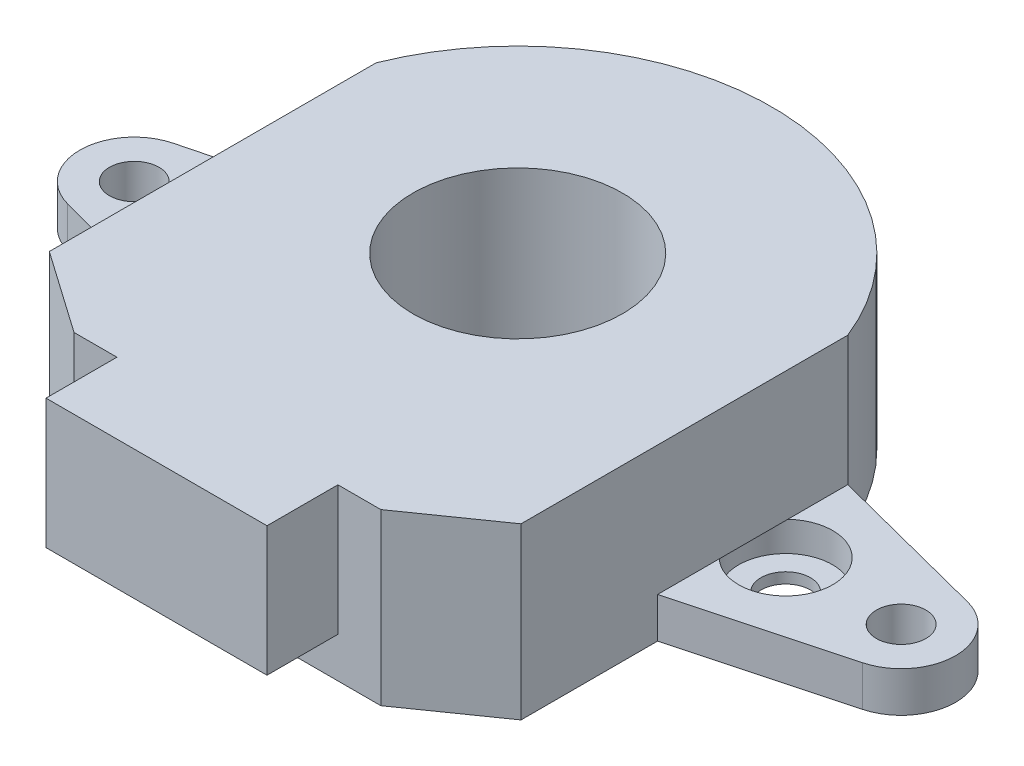
ISO-10303-21;
HEADER;
FILE_DESCRIPTION(('STEP AP214'),'2;1');
FILE_NAME('part.step','',(''),(''),'','','');
FILE_SCHEMA(('AUTOMOTIVE_DESIGN { 1 0 10303 214 1 1 1 1 }'));
ENDSEC;
DATA;
#1=APPLICATION_CONTEXT('core data for automotive mechanical design processes');
#2=APPLICATION_PROTOCOL_DEFINITION('international standard','automotive_design',2000,#1);
#3=PRODUCT_CONTEXT('',#1,'mechanical');
#4=PRODUCT('Part','Part','',(#3));
#5=PRODUCT_RELATED_PRODUCT_CATEGORY('part','',(#4));
#6=PRODUCT_DEFINITION_FORMATION('','',#4);
#7=PRODUCT_DEFINITION_CONTEXT('part definition',#1,'design');
#8=PRODUCT_DEFINITION('design','',#6,#7);
#9=PRODUCT_DEFINITION_SHAPE('','',#8);
#10=(LENGTH_UNIT() NAMED_UNIT(*) SI_UNIT(.MILLI.,.METRE.));
#11=(NAMED_UNIT(*) PLANE_ANGLE_UNIT() SI_UNIT($,.RADIAN.));
#12=(NAMED_UNIT(*) SI_UNIT($,.STERADIAN.) SOLID_ANGLE_UNIT());
#13=UNCERTAINTY_MEASURE_WITH_UNIT(LENGTH_MEASURE(1.E-05),#10,'distance_accuracy_value','');
#14=(GEOMETRIC_REPRESENTATION_CONTEXT(3) GLOBAL_UNCERTAINTY_ASSIGNED_CONTEXT((#13)) GLOBAL_UNIT_ASSIGNED_CONTEXT((#10,
#11,#12)) REPRESENTATION_CONTEXT('',''));
#15=CARTESIAN_POINT('',(0.,0.,0.));
#16=DIRECTION('',(0.,0.,1.));
#17=DIRECTION('',(1.,0.,0.));
#18=AXIS2_PLACEMENT_3D('',#15,#16,#17);
#19=CARTESIAN_POINT('',(0.,2.45,0.));
#20=DIRECTION('',(0.,1.,0.));
#21=DIRECTION('',(0.,0.,1.));
#22=AXIS2_PLACEMENT_3D('',#19,#20,#21);
#23=PLANE('',#22);
#24=DIRECTION('',(0.,0.,-1.));
#25=VECTOR('',#24,1.);
#26=CARTESIAN_POINT('',(14.3,2.45,-5.7157676649773));
#27=LINE('',#26,#25);
#28=CARTESIAN_POINT('',(14.3,2.45,5.81455666761185));
#29=VERTEX_POINT('',#28);
#30=CARTESIAN_POINT('',(14.3,2.45,2.07846096908265));
#31=VERTEX_POINT('',#30);
#32=EDGE_CURVE('E11',#29,#31,#27,.T.);
#33=ORIENTED_EDGE('',*,*,#32,.F.);
#34=DIRECTION('',(-0.965925826289068,0.,0.258819045102523));
#35=VECTOR('',#34,1.);
#36=CARTESIAN_POINT('',(2.41155752984425,2.45,9.00005522675396));
#37=LINE('',#36,#35);
#38=CARTESIAN_POINT('',(24.1041028488383,2.45,3.18755522675393));
#39=VERTEX_POINT('',#38);
#40=EDGE_CURVE('E329',#39,#29,#37,.T.);
#41=ORIENTED_EDGE('',*,*,#40,.F.);
#42=CARTESIAN_POINT('',(23.25,2.45,0.));
#43=DIRECTION('',(0.,1.,0.));
#44=DIRECTION('',(0.,0.,1.));
#45=AXIS2_PLACEMENT_3D('',#42,#43,#44);
#46=CIRCLE('',#45,3.3);
#47=CARTESIAN_POINT('',(24.0739769814121,2.45,-3.19547522820989));
#48=VERTEX_POINT('',#47);
#49=EDGE_CURVE('E323',#48,#39,#46,.F.);
#50=ORIENTED_EDGE('',*,*,#49,.F.);
#51=DIRECTION('',(-0.96832582673027,0.,-0.249689994367294));
#52=VECTOR('',#51,1.);
#53=CARTESIAN_POINT('',(2.27350040033806,2.45,-8.81688976087108));
#54=LINE('',#53,#52);
#55=CARTESIAN_POINT('',(14.3,2.45,-5.7157676649773));
#56=VERTEX_POINT('',#55);
#57=EDGE_CURVE('E326',#48,#56,#54,.T.);
#58=ORIENTED_EDGE('',*,*,#57,.T.);
#59=CARTESIAN_POINT('',(14.3,2.45,-2.07846096908265));
#60=VERTEX_POINT('',#59);
#61=EDGE_CURVE('E44',#60,#56,#27,.T.);
#62=ORIENTED_EDGE('',*,*,#61,.F.);
#63=CARTESIAN_POINT('',(16.25,2.45,0.));
#64=DIRECTION('',(0.,1.,0.));
#65=DIRECTION('',(0.,0.,1.));
#66=AXIS2_PLACEMENT_3D('',#63,#64,#65);
#67=CIRCLE('',#66,2.85);
#68=EDGE_CURVE('E316',#31,#60,#67,.T.);
#69=ORIENTED_EDGE('',*,*,#68,.F.);
#70=EDGE_LOOP('',(#33,#41,#50,#58,#62,#69));
#71=FACE_BOUND('',#70,.T.);
#72=CARTESIAN_POINT('',(23.25,2.45,0.));
#73=DIRECTION('',(0.,1.,0.));
#74=DIRECTION('',(0.,0.,1.));
#75=AXIS2_PLACEMENT_3D('',#72,#73,#74);
#76=CIRCLE('',#75,1.5);
#77=CARTESIAN_POINT('',(23.25,2.45,1.5));
#78=VERTEX_POINT('',#77);
#79=EDGE_CURVE('E330',#78,#78,#76,.T.);
#80=ORIENTED_EDGE('',*,*,#79,.F.);
#81=EDGE_LOOP('',(#80));
#82=FACE_BOUND('',#81,.T.);
#83=ADVANCED_FACE('F35',(#71,#82),#23,.T.);
#84=CARTESIAN_POINT('',(-16.25,2.45,0.));
#85=DIRECTION('',(0.,-1.,0.));
#86=DIRECTION('',(0.,0.,-1.));
#87=AXIS2_PLACEMENT_3D('',#84,#85,#86);
#88=CYLINDRICAL_SURFACE('',#87,1.5);
#89=CARTESIAN_POINT('',(-16.25,0.,0.));
#90=DIRECTION('',(0.,-1.,0.));
#91=DIRECTION('',(0.,0.,1.));
#92=AXIS2_PLACEMENT_3D('',#89,#90,#91);
#93=CIRCLE('',#92,1.5);
#94=CARTESIAN_POINT('',(-16.25,0.,1.5));
#95=VERTEX_POINT('',#94);
#96=EDGE_CURVE('E450',#95,#95,#93,.T.);
#97=ORIENTED_EDGE('',*,*,#96,.T.);
#98=EDGE_LOOP('',(#97));
#99=FACE_BOUND('',#98,.T.);
#100=CARTESIAN_POINT('',(-16.25,0.65,0.));
#101=DIRECTION('',(0.,1.,0.));
#102=DIRECTION('',(0.,0.,1.));
#103=AXIS2_PLACEMENT_3D('',#100,#101,#102);
#104=CIRCLE('',#103,1.5);
#105=CARTESIAN_POINT('',(-16.25,0.65,1.5));
#106=VERTEX_POINT('',#105);
#107=EDGE_CURVE('E445',#106,#106,#104,.F.);
#108=ORIENTED_EDGE('',*,*,#107,.F.);
#109=EDGE_LOOP('',(#108));
#110=FACE_BOUND('',#109,.T.);
#111=ADVANCED_FACE('F411',(#99,#110),#88,.F.);
#112=CARTESIAN_POINT('',(16.25,2.45,0.));
#113=DIRECTION('',(0.,-1.,0.));
#114=DIRECTION('',(0.,0.,-1.));
#115=AXIS2_PLACEMENT_3D('',#112,#113,#114);
#116=CYLINDRICAL_SURFACE('',#115,1.5);
#117=CARTESIAN_POINT('',(16.25,0.,0.));
#118=DIRECTION('',(0.,1.,0.));
#119=DIRECTION('',(0.,0.,1.));
#120=AXIS2_PLACEMENT_3D('',#117,#118,#119);
#121=CIRCLE('',#120,1.5);
#122=CARTESIAN_POINT('',(16.25,0.,1.5));
#123=VERTEX_POINT('',#122);
#124=EDGE_CURVE('E327',#123,#123,#121,.T.);
#125=ORIENTED_EDGE('',*,*,#124,.F.);
#126=EDGE_LOOP('',(#125));
#127=FACE_BOUND('',#126,.T.);
#128=CARTESIAN_POINT('',(16.25,0.65,0.));
#129=DIRECTION('',(0.,1.,0.));
#130=DIRECTION('',(0.,0.,1.));
#131=AXIS2_PLACEMENT_3D('',#128,#129,#130);
#132=CIRCLE('',#131,1.5);
#133=CARTESIAN_POINT('',(16.25,0.65,1.5));
#134=VERTEX_POINT('',#133);
#135=EDGE_CURVE('E294',#134,#134,#132,.T.);
#136=ORIENTED_EDGE('',*,*,#135,.T.);
#137=EDGE_LOOP('',(#136));
#138=FACE_BOUND('',#137,.T.);
#139=ADVANCED_FACE('F419',(#127,#138),#116,.F.);
#140=CARTESIAN_POINT('',(14.3,2.45,-5.7157676649773));
#141=DIRECTION('',(-1.,0.,0.));
#142=DIRECTION('',(0.,0.,1.));
#143=AXIS2_PLACEMENT_3D('',#140,#141,#142);
#144=PLANE('',#143);
#145=DIRECTION('',(0.,-1.,0.));
#146=VECTOR('',#145,1.);
#147=CARTESIAN_POINT('',(14.3,2.45,5.81455666761185));
#148=LINE('',#147,#146);
#149=CARTESIAN_POINT('',(14.3,0.,5.81455666761185));
#150=VERTEX_POINT('',#149);
#151=EDGE_CURVE('E347',#29,#150,#148,.T.);
#152=ORIENTED_EDGE('',*,*,#151,.F.);
#153=ORIENTED_EDGE('',*,*,#32,.T.);
#154=EDGE_CURVE('E184',#31,#60,#27,.T.);
#155=ORIENTED_EDGE('',*,*,#154,.T.);
#156=ORIENTED_EDGE('',*,*,#61,.T.);
#157=DIRECTION('',(0.,-1.,0.));
#158=VECTOR('',#157,1.);
#159=CARTESIAN_POINT('',(14.3,10.3,-5.7157676649773));
#160=LINE('',#159,#158);
#161=CARTESIAN_POINT('',(14.3,10.3,-5.7157676649773));
#162=VERTEX_POINT('',#161);
#163=EDGE_CURVE('E238',#162,#56,#160,.T.);
#164=ORIENTED_EDGE('',*,*,#163,.F.);
#165=DIRECTION('',(0.,0.,-1.));
#166=VECTOR('',#165,1.);
#167=CARTESIAN_POINT('',(14.3,10.3,-5.7157676649773));
#168=LINE('',#167,#166);
#169=CARTESIAN_POINT('',(14.3,10.3,14.0989623089514));
#170=VERTEX_POINT('',#169);
#171=EDGE_CURVE('E179',#170,#162,#168,.T.);
#172=ORIENTED_EDGE('',*,*,#171,.F.);
#173=DIRECTION('',(0.,-1.,0.));
#174=VECTOR('',#173,1.);
#175=CARTESIAN_POINT('',(14.3,2.45,14.0989623089515));
#176=LINE('',#175,#174);
#177=CARTESIAN_POINT('',(14.3,0.,14.0989623089514));
#178=VERTEX_POINT('',#177);
#179=EDGE_CURVE('E255',#170,#178,#176,.T.);
#180=ORIENTED_EDGE('',*,*,#179,.T.);
#181=DIRECTION('',(0.,0.,-1.));
#182=VECTOR('',#181,1.);
#183=CARTESIAN_POINT('',(14.3,0.,-5.7157676649773));
#184=LINE('',#183,#182);
#185=EDGE_CURVE('E276',#178,#150,#184,.T.);
#186=ORIENTED_EDGE('',*,*,#185,.T.);
#187=EDGE_LOOP('',(#152,#153,#155,#156,#164,#172,#180,#186));
#188=FACE_BOUND('',#187,.T.);
#189=ADVANCED_FACE('F370',(#188),#144,.F.);
#190=DIRECTION('',(0.,0.,-1.));
#191=VECTOR('',#190,1.);
#192=CARTESIAN_POINT('',(-14.3,2.45,-5.7157676649773));
#193=LINE('',#192,#191);
#194=CARTESIAN_POINT('',(-14.3,2.45,-2.07846096908265));
#195=VERTEX_POINT('',#194);
#196=CARTESIAN_POINT('',(-14.3,2.45,-5.7157676649773));
#197=VERTEX_POINT('',#196);
#198=EDGE_CURVE('E224',#195,#197,#193,.T.);
#199=ORIENTED_EDGE('',*,*,#198,.T.);
#200=DIRECTION('',(0.96832582673027,0.,-0.249689994367294));
#201=VECTOR('',#200,1.);
#202=CARTESIAN_POINT('',(-2.27350040033806,2.45,-8.81688976087108));
#203=LINE('',#202,#201);
#204=CARTESIAN_POINT('',(-24.0739769814121,2.45,-3.19547522820989));
#205=VERTEX_POINT('',#204);
#206=EDGE_CURVE('E438',#205,#197,#203,.T.);
#207=ORIENTED_EDGE('',*,*,#206,.F.);
#208=CARTESIAN_POINT('',(-23.25,2.45,0.));
#209=DIRECTION('',(0.,-1.,0.));
#210=DIRECTION('',(0.,0.,1.));
#211=AXIS2_PLACEMENT_3D('',#208,#209,#210);
#212=CIRCLE('',#211,3.3);
#213=CARTESIAN_POINT('',(-24.1041028488383,2.45,3.18755522675393));
#214=VERTEX_POINT('',#213);
#215=EDGE_CURVE('E452',#205,#214,#212,.F.);
#216=ORIENTED_EDGE('',*,*,#215,.T.);
#217=DIRECTION('',(0.965925826289068,0.,0.258819045102523));
#218=VECTOR('',#217,1.);
#219=CARTESIAN_POINT('',(-2.41155752984425,2.45,9.00005522675396));
#220=LINE('',#219,#218);
#221=CARTESIAN_POINT('',(-14.3,2.45,5.81455666761185));
#222=VERTEX_POINT('',#221);
#223=EDGE_CURVE('E308',#214,#222,#220,.T.);
#224=ORIENTED_EDGE('',*,*,#223,.T.);
#225=CARTESIAN_POINT('',(-14.3,2.45,2.07846096908265));
#226=VERTEX_POINT('',#225);
#227=EDGE_CURVE('E60',#222,#226,#193,.T.);
#228=ORIENTED_EDGE('',*,*,#227,.T.);
#229=CARTESIAN_POINT('',(-16.25,2.45,0.));
#230=DIRECTION('',(0.,-1.,0.));
#231=DIRECTION('',(0.,0.,1.));
#232=AXIS2_PLACEMENT_3D('',#229,#230,#231);
#233=CIRCLE('',#232,2.85);
#234=EDGE_CURVE('E246',#226,#195,#233,.T.);
#235=ORIENTED_EDGE('',*,*,#234,.T.);
#236=EDGE_LOOP('',(#199,#207,#216,#224,#228,#235));
#237=FACE_BOUND('',#236,.T.);
#238=CARTESIAN_POINT('',(-23.25,2.45,0.));
#239=DIRECTION('',(0.,-1.,0.));
#240=DIRECTION('',(0.,0.,1.));
#241=AXIS2_PLACEMENT_3D('',#238,#239,#240);
#242=CIRCLE('',#241,1.5);
#243=CARTESIAN_POINT('',(-23.25,2.45,1.5));
#244=VERTEX_POINT('',#243);
#245=EDGE_CURVE('E436',#244,#244,#242,.T.);
#246=ORIENTED_EDGE('',*,*,#245,.T.);
#247=EDGE_LOOP('',(#246));
#248=FACE_BOUND('',#247,.T.);
#249=ADVANCED_FACE('F413',(#237,#248),#23,.T.);
#250=CARTESIAN_POINT('',(0.,0.,0.));
#251=DIRECTION('',(0.,1.,0.));
#252=DIRECTION('',(0.,0.,1.));
#253=AXIS2_PLACEMENT_3D('',#250,#251,#252);
#254=PLANE('',#253);
#255=DIRECTION('',(1.,0.,0.));
#256=VECTOR('',#255,1.);
#257=CARTESIAN_POINT('',(-14.3,0.,17.6));
#258=LINE('',#257,#256);
#259=CARTESIAN_POINT('',(-9.29999999999996,0.,17.6));
#260=VERTEX_POINT('',#259);
#261=CARTESIAN_POINT('',(9.29999999999996,0.,17.6));
#262=VERTEX_POINT('',#261);
#263=EDGE_CURVE('E288',#260,#262,#258,.T.);
#264=ORIENTED_EDGE('',*,*,#263,.F.);
#265=DIRECTION('',(0.819152044288993,0.,0.573576436351044));
#266=VECTOR('',#265,1.);
#267=CARTESIAN_POINT('',(-9.29999999999996,0.,17.6));
#268=LINE('',#267,#266);
#269=CARTESIAN_POINT('',(-14.3,0.,14.0989623089514));
#270=VERTEX_POINT('',#269);
#271=EDGE_CURVE('E383',#260,#270,#268,.F.);
#272=ORIENTED_EDGE('',*,*,#271,.T.);
#273=DIRECTION('',(0.,0.,1.));
#274=VECTOR('',#273,1.);
#275=CARTESIAN_POINT('',(-14.3,0.,-5.7157676649773));
#276=LINE('',#275,#274);
#277=CARTESIAN_POINT('',(-14.3,0.,5.81455666761185));
#278=VERTEX_POINT('',#277);
#279=EDGE_CURVE('E291',#278,#270,#276,.T.);
#280=ORIENTED_EDGE('',*,*,#279,.F.);
#281=DIRECTION('',(0.965925826289068,0.,0.258819045102523));
#282=VECTOR('',#281,1.);
#283=CARTESIAN_POINT('',(-2.41155752984425,0.,9.00005522675396));
#284=LINE('',#283,#282);
#285=CARTESIAN_POINT('',(-24.1041028488383,0.,3.18755522675393));
#286=VERTEX_POINT('',#285);
#287=EDGE_CURVE('E296',#286,#278,#284,.T.);
#288=ORIENTED_EDGE('',*,*,#287,.F.);
#289=CARTESIAN_POINT('',(-23.25,0.,0.));
#290=DIRECTION('',(0.,-1.,0.));
#291=DIRECTION('',(0.,0.,1.));
#292=AXIS2_PLACEMENT_3D('',#289,#290,#291);
#293=CIRCLE('',#292,3.3);
#294=CARTESIAN_POINT('',(-24.0739769814121,0.,-3.19547522820989));
#295=VERTEX_POINT('',#294);
#296=EDGE_CURVE('E299',#295,#286,#293,.F.);
#297=ORIENTED_EDGE('',*,*,#296,.F.);
#298=DIRECTION('',(0.96832582673027,0.,-0.249689994367294));
#299=VECTOR('',#298,1.);
#300=CARTESIAN_POINT('',(-2.27350040033806,0.,-8.81688976087108));
#301=LINE('',#300,#299);
#302=CARTESIAN_POINT('',(-14.3,0.,-5.7157676649773));
#303=VERTEX_POINT('',#302);
#304=EDGE_CURVE('E298',#295,#303,#301,.T.);
#305=ORIENTED_EDGE('',*,*,#304,.T.);
#306=CARTESIAN_POINT('',(0.,0.,0.));
#307=DIRECTION('',(0.,1.,0.));
#308=DIRECTION('',(0.,0.,1.));
#309=AXIS2_PLACEMENT_3D('',#306,#307,#308);
#310=CIRCLE('',#309,15.4);
#311=CARTESIAN_POINT('',(14.3,0.,-5.7157676649773));
#312=VERTEX_POINT('',#311);
#313=EDGE_CURVE('E273',#312,#303,#310,.T.);
#314=ORIENTED_EDGE('',*,*,#313,.F.);
#315=DIRECTION('',(-0.96832582673027,0.,-0.249689994367294));
#316=VECTOR('',#315,1.);
#317=CARTESIAN_POINT('',(2.27350040033806,0.,-8.81688976087108));
#318=LINE('',#317,#316);
#319=CARTESIAN_POINT('',(24.0739769814121,0.,-3.19547522820989));
#320=VERTEX_POINT('',#319);
#321=EDGE_CURVE('E337',#320,#312,#318,.T.);
#322=ORIENTED_EDGE('',*,*,#321,.F.);
#323=CARTESIAN_POINT('',(23.25,0.,0.));
#324=DIRECTION('',(0.,1.,0.));
#325=DIRECTION('',(0.,0.,1.));
#326=AXIS2_PLACEMENT_3D('',#323,#324,#325);
#327=CIRCLE('',#326,3.3);
#328=CARTESIAN_POINT('',(24.1041028488383,0.,3.18755522675393));
#329=VERTEX_POINT('',#328);
#330=EDGE_CURVE('E334',#320,#329,#327,.F.);
#331=ORIENTED_EDGE('',*,*,#330,.T.);
#332=DIRECTION('',(-0.965925826289068,0.,0.258819045102523));
#333=VECTOR('',#332,1.);
#334=CARTESIAN_POINT('',(2.41155752984425,0.,9.00005522675396));
#335=LINE('',#334,#333);
#336=EDGE_CURVE('E340',#329,#150,#335,.T.);
#337=ORIENTED_EDGE('',*,*,#336,.T.);
#338=ORIENTED_EDGE('',*,*,#185,.F.);
#339=DIRECTION('',(0.819152044288993,0.,-0.573576436351044));
#340=VECTOR('',#339,1.);
#341=CARTESIAN_POINT('',(14.3,0.,14.0989623089515));
#342=LINE('',#341,#340);
#343=EDGE_CURVE('E380',#178,#262,#342,.F.);
#344=ORIENTED_EDGE('',*,*,#343,.T.);
#345=EDGE_LOOP('',(#264,#272,#280,#288,#297,#305,#314,#322,#331,#337,#338,#344));
#346=FACE_BOUND('',#345,.T.);
#347=CARTESIAN_POINT('',(0.,0.,0.));
#348=DIRECTION('',(0.,1.,0.));
#349=DIRECTION('',(0.,0.,1.));
#350=AXIS2_PLACEMENT_3D('',#347,#348,#349);
#351=CIRCLE('',#350,6.35);
#352=CARTESIAN_POINT('',(0.,0.,6.35));
#353=VERTEX_POINT('',#352);
#354=EDGE_CURVE('E284',#353,#353,#351,.T.);
#355=ORIENTED_EDGE('',*,*,#354,.T.);
#356=EDGE_LOOP('',(#355));
#357=FACE_BOUND('',#356,.T.);
#358=CARTESIAN_POINT('',(23.25,0.,0.));
#359=DIRECTION('',(0.,1.,0.));
#360=DIRECTION('',(0.,0.,1.));
#361=AXIS2_PLACEMENT_3D('',#358,#359,#360);
#362=CIRCLE('',#361,1.5);
#363=CARTESIAN_POINT('',(23.25,0.,1.5));
#364=VERTEX_POINT('',#363);
#365=EDGE_CURVE('E341',#364,#364,#362,.T.);
#366=ORIENTED_EDGE('',*,*,#365,.T.);
#367=EDGE_LOOP('',(#366));
#368=FACE_BOUND('',#367,.T.);
#369=ORIENTED_EDGE('',*,*,#124,.T.);
#370=EDGE_LOOP('',(#369));
#371=FACE_BOUND('',#370,.T.);
#372=CARTESIAN_POINT('',(-23.25,0.,0.));
#373=DIRECTION('',(0.,-1.,0.));
#374=DIRECTION('',(0.,0.,1.));
#375=AXIS2_PLACEMENT_3D('',#372,#373,#374);
#376=CIRCLE('',#375,1.5);
#377=CARTESIAN_POINT('',(-23.25,0.,1.5));
#378=VERTEX_POINT('',#377);
#379=EDGE_CURVE('E448',#378,#378,#376,.T.);
#380=ORIENTED_EDGE('',*,*,#379,.F.);
#381=EDGE_LOOP('',(#380));
#382=FACE_BOUND('',#381,.T.);
#383=ORIENTED_EDGE('',*,*,#96,.F.);
#384=EDGE_LOOP('',(#383));
#385=FACE_BOUND('',#384,.T.);
#386=ADVANCED_FACE('F386',(#346,#357,#368,#371,#382,#385),#254,.F.);
#387=CARTESIAN_POINT('',(-14.3,2.45,-5.7157676649773));
#388=DIRECTION('',(1.,0.,0.));
#389=DIRECTION('',(0.,0.,-1.));
#390=AXIS2_PLACEMENT_3D('',#387,#388,#389);
#391=PLANE('',#390);
#392=ORIENTED_EDGE('',*,*,#279,.T.);
#393=DIRECTION('',(0.,1.,0.));
#394=VECTOR('',#393,1.);
#395=CARTESIAN_POINT('',(-14.3,2.45,14.0989623089514));
#396=LINE('',#395,#394);
#397=CARTESIAN_POINT('',(-14.3,10.3,14.0989623089514));
#398=VERTEX_POINT('',#397);
#399=EDGE_CURVE('E200',#270,#398,#396,.T.);
#400=ORIENTED_EDGE('',*,*,#399,.T.);
#401=DIRECTION('',(0.,0.,-1.));
#402=VECTOR('',#401,1.);
#403=CARTESIAN_POINT('',(-14.3,10.3,-5.7157676649773));
#404=LINE('',#403,#402);
#405=CARTESIAN_POINT('',(-14.3,10.3,-5.7157676649773));
#406=VERTEX_POINT('',#405);
#407=EDGE_CURVE('E175',#398,#406,#404,.T.);
#408=ORIENTED_EDGE('',*,*,#407,.T.);
#409=DIRECTION('',(0.,-1.,0.));
#410=VECTOR('',#409,1.);
#411=CARTESIAN_POINT('',(-14.3,10.3,-5.7157676649773));
#412=LINE('',#411,#410);
#413=EDGE_CURVE('E188',#406,#197,#412,.T.);
#414=ORIENTED_EDGE('',*,*,#413,.T.);
#415=ORIENTED_EDGE('',*,*,#198,.F.);
#416=EDGE_CURVE('E222',#226,#195,#193,.T.);
#417=ORIENTED_EDGE('',*,*,#416,.F.);
#418=ORIENTED_EDGE('',*,*,#227,.F.);
#419=DIRECTION('',(0.,-1.,0.));
#420=VECTOR('',#419,1.);
#421=CARTESIAN_POINT('',(-14.3,2.45,5.81455666761185));
#422=LINE('',#421,#420);
#423=EDGE_CURVE('E302',#222,#278,#422,.T.);
#424=ORIENTED_EDGE('',*,*,#423,.T.);
#425=EDGE_LOOP('',(#392,#400,#408,#414,#415,#417,#418,#424));
#426=FACE_BOUND('',#425,.T.);
#427=ADVANCED_FACE('F198',(#426),#391,.F.);
#428=CARTESIAN_POINT('',(-14.3,2.45,17.6));
#429=DIRECTION('',(0.,0.,-1.));
#430=DIRECTION('',(-1.,0.,0.));
#431=AXIS2_PLACEMENT_3D('',#428,#429,#430);
#432=PLANE('',#431);
#433=DIRECTION('',(1.,0.,0.));
#434=VECTOR('',#433,1.);
#435=CARTESIAN_POINT('',(-14.3,2.45,17.6));
#436=LINE('',#435,#434);
#437=CARTESIAN_POINT('',(-6.7,2.45,17.6));
#438=VERTEX_POINT('',#437);
#439=CARTESIAN_POINT('',(6.69999999999999,2.45,17.6));
#440=VERTEX_POINT('',#439);
#441=EDGE_CURVE('E52',#438,#440,#436,.T.);
#442=ORIENTED_EDGE('',*,*,#441,.F.);
#443=DIRECTION('',(0.,-1.,0.));
#444=VECTOR('',#443,1.);
#445=CARTESIAN_POINT('',(-6.7,10.3,17.6));
#446=LINE('',#445,#444);
#447=CARTESIAN_POINT('',(-6.7,10.3,17.6));
#448=VERTEX_POINT('',#447);
#449=EDGE_CURVE('E195',#448,#438,#446,.T.);
#450=ORIENTED_EDGE('',*,*,#449,.F.);
#451=DIRECTION('',(-1.,0.,0.));
#452=VECTOR('',#451,1.);
#453=CARTESIAN_POINT('',(-9.29999999999996,10.3,17.6));
#454=LINE('',#453,#452);
#455=CARTESIAN_POINT('',(-9.29999999999996,10.3,17.6));
#456=VERTEX_POINT('',#455);
#457=EDGE_CURVE('E204',#448,#456,#454,.T.);
#458=ORIENTED_EDGE('',*,*,#457,.T.);
#459=DIRECTION('',(0.,-1.,0.));
#460=VECTOR('',#459,1.);
#461=CARTESIAN_POINT('',(-9.29999999999996,2.45,17.6));
#462=LINE('',#461,#460);
#463=EDGE_CURVE('E378',#456,#260,#462,.T.);
#464=ORIENTED_EDGE('',*,*,#463,.T.);
#465=ORIENTED_EDGE('',*,*,#263,.T.);
#466=DIRECTION('',(0.,1.,0.));
#467=VECTOR('',#466,1.);
#468=CARTESIAN_POINT('',(9.29999999999997,2.45,17.6));
#469=LINE('',#468,#467);
#470=CARTESIAN_POINT('',(9.29999999999996,10.3,17.6));
#471=VERTEX_POINT('',#470);
#472=EDGE_CURVE('E534',#262,#471,#469,.T.);
#473=ORIENTED_EDGE('',*,*,#472,.T.);
#474=DIRECTION('',(1.,0.,0.));
#475=VECTOR('',#474,1.);
#476=CARTESIAN_POINT('',(9.29999999999996,10.3,17.6));
#477=LINE('',#476,#475);
#478=CARTESIAN_POINT('',(6.7,10.3,17.6));
#479=VERTEX_POINT('',#478);
#480=EDGE_CURVE('E232',#479,#471,#477,.T.);
#481=ORIENTED_EDGE('',*,*,#480,.F.);
#482=DIRECTION('',(0.,-1.,0.));
#483=VECTOR('',#482,1.);
#484=CARTESIAN_POINT('',(6.7,10.3,17.6));
#485=LINE('',#484,#483);
#486=EDGE_CURVE('E242',#479,#440,#485,.T.);
#487=ORIENTED_EDGE('',*,*,#486,.T.);
#488=EDGE_LOOP('',(#442,#450,#458,#464,#465,#473,#481,#487));
#489=FACE_BOUND('',#488,.T.);
#490=ADVANCED_FACE('F263',(#489),#432,.F.);
#491=CARTESIAN_POINT('',(0.,2.45,0.));
#492=DIRECTION('',(0.,-1.,0.));
#493=DIRECTION('',(0.,0.,-1.));
#494=AXIS2_PLACEMENT_3D('',#491,#492,#493);
#495=CYLINDRICAL_SURFACE('',#494,15.4);
#496=DIRECTION('',(0.,-1.,0.));
#497=VECTOR('',#496,1.);
#498=CARTESIAN_POINT('',(-14.3,2.45,-5.7157676649773));
#499=LINE('',#498,#497);
#500=EDGE_CURVE('E191',#197,#303,#499,.T.);
#501=ORIENTED_EDGE('',*,*,#500,.F.);
#502=ORIENTED_EDGE('',*,*,#413,.F.);
#503=CARTESIAN_POINT('',(0.,10.3,0.));
#504=DIRECTION('',(0.,1.,0.));
#505=DIRECTION('',(0.,0.,-1.));
#506=AXIS2_PLACEMENT_3D('',#503,#504,#505);
#507=CIRCLE('',#506,15.4);
#508=EDGE_CURVE('E168',#162,#406,#507,.T.);
#509=ORIENTED_EDGE('',*,*,#508,.F.);
#510=ORIENTED_EDGE('',*,*,#163,.T.);
#511=DIRECTION('',(0.,-1.,0.));
#512=VECTOR('',#511,1.);
#513=CARTESIAN_POINT('',(14.3,2.45,-5.7157676649773));
#514=LINE('',#513,#512);
#515=EDGE_CURVE('E274',#56,#312,#514,.T.);
#516=ORIENTED_EDGE('',*,*,#515,.T.);
#517=ORIENTED_EDGE('',*,*,#313,.T.);
#518=EDGE_LOOP('',(#501,#502,#509,#510,#516,#517));
#519=FACE_BOUND('',#518,.T.);
#520=ADVANCED_FACE('F189',(#519),#495,.T.);
#521=CARTESIAN_POINT('',(0.,2.45,0.));
#522=DIRECTION('',(0.,-1.,0.));
#523=DIRECTION('',(0.,0.,-1.));
#524=AXIS2_PLACEMENT_3D('',#521,#522,#523);
#525=CYLINDRICAL_SURFACE('',#524,6.35);
#526=CARTESIAN_POINT('',(0.,10.3,0.));
#527=DIRECTION('',(0.,-1.,0.));
#528=DIRECTION('',(0.,0.,1.));
#529=AXIS2_PLACEMENT_3D('',#526,#527,#528);
#530=CIRCLE('',#529,6.35);
#531=CARTESIAN_POINT('',(0.,10.3,6.35));
#532=VERTEX_POINT('',#531);
#533=EDGE_CURVE('E183',#532,#532,#530,.T.);
#534=ORIENTED_EDGE('',*,*,#533,.F.);
#535=EDGE_LOOP('',(#534));
#536=FACE_BOUND('',#535,.T.);
#537=ORIENTED_EDGE('',*,*,#354,.F.);
#538=EDGE_LOOP('',(#537));
#539=FACE_BOUND('',#538,.T.);
#540=ADVANCED_FACE('F515',(#536,#539),#525,.F.);
#541=CARTESIAN_POINT('',(23.25,2.45,0.));
#542=DIRECTION('',(0.,-1.,0.));
#543=DIRECTION('',(0.,0.,-1.));
#544=AXIS2_PLACEMENT_3D('',#541,#542,#543);
#545=CYLINDRICAL_SURFACE('',#544,3.3);
#546=ORIENTED_EDGE('',*,*,#330,.F.);
#547=DIRECTION('',(0.,-1.,0.));
#548=VECTOR('',#547,1.);
#549=CARTESIAN_POINT('',(24.0739769814121,2.45,-3.19547522820989));
#550=LINE('',#549,#548);
#551=EDGE_CURVE('E349',#48,#320,#550,.T.);
#552=ORIENTED_EDGE('',*,*,#551,.F.);
#553=ORIENTED_EDGE('',*,*,#49,.T.);
#554=DIRECTION('',(0.,-1.,0.));
#555=VECTOR('',#554,1.);
#556=CARTESIAN_POINT('',(24.1041028488383,2.45,3.18755522675393));
#557=LINE('',#556,#555);
#558=EDGE_CURVE('E333',#39,#329,#557,.T.);
#559=ORIENTED_EDGE('',*,*,#558,.T.);
#560=EDGE_LOOP('',(#546,#552,#553,#559));
#561=FACE_BOUND('',#560,.T.);
#562=ADVANCED_FACE('F512',(#561),#545,.T.);
#563=CARTESIAN_POINT('',(2.27350040033806,2.45,-8.81688976087108));
#564=DIRECTION('',(-0.249689994367294,0.,0.96832582673027));
#565=DIRECTION('',(0.96832582673027,0.,0.249689994367294));
#566=AXIS2_PLACEMENT_3D('',#563,#564,#565);
#567=PLANE('',#566);
#568=ORIENTED_EDGE('',*,*,#321,.T.);
#569=ORIENTED_EDGE('',*,*,#515,.F.);
#570=ORIENTED_EDGE('',*,*,#57,.F.);
#571=ORIENTED_EDGE('',*,*,#551,.T.);
#572=EDGE_LOOP('',(#568,#569,#570,#571));
#573=FACE_BOUND('',#572,.T.);
#574=ADVANCED_FACE('F506',(#573),#567,.F.);
#575=CARTESIAN_POINT('',(23.25,2.45,0.));
#576=DIRECTION('',(0.,-1.,0.));
#577=DIRECTION('',(0.,0.,-1.));
#578=AXIS2_PLACEMENT_3D('',#575,#576,#577);
#579=CYLINDRICAL_SURFACE('',#578,1.5);
#580=ORIENTED_EDGE('',*,*,#79,.T.);
#581=EDGE_LOOP('',(#580));
#582=FACE_BOUND('',#581,.T.);
#583=ORIENTED_EDGE('',*,*,#365,.F.);
#584=EDGE_LOOP('',(#583));
#585=FACE_BOUND('',#584,.T.);
#586=ADVANCED_FACE('F503',(#582,#585),#579,.F.);
#587=CARTESIAN_POINT('',(2.41155752984425,2.45,9.00005522675396));
#588=DIRECTION('',(0.258819045102523,0.,0.965925826289068));
#589=DIRECTION('',(0.965925826289068,0.,-0.258819045102523));
#590=AXIS2_PLACEMENT_3D('',#587,#588,#589);
#591=PLANE('',#590);
#592=ORIENTED_EDGE('',*,*,#336,.F.);
#593=ORIENTED_EDGE('',*,*,#558,.F.);
#594=ORIENTED_EDGE('',*,*,#40,.T.);
#595=ORIENTED_EDGE('',*,*,#151,.T.);
#596=EDGE_LOOP('',(#592,#593,#594,#595));
#597=FACE_BOUND('',#596,.T.);
#598=ADVANCED_FACE('F363',(#597),#591,.T.);
#599=CARTESIAN_POINT('',(16.25,0.65,0.));
#600=DIRECTION('',(0.,1.,0.));
#601=DIRECTION('',(0.,0.,1.));
#602=AXIS2_PLACEMENT_3D('',#599,#600,#601);
#603=CYLINDRICAL_SURFACE('',#602,2.85);
#604=CARTESIAN_POINT('',(16.25,0.65,0.));
#605=DIRECTION('',(0.,1.,0.));
#606=DIRECTION('',(0.,0.,1.));
#607=AXIS2_PLACEMENT_3D('',#604,#605,#606);
#608=CIRCLE('',#607,2.85);
#609=CARTESIAN_POINT('',(16.25,0.65,2.85));
#610=VERTEX_POINT('',#609);
#611=EDGE_CURVE('E317',#610,#610,#608,.T.);
#612=ORIENTED_EDGE('',*,*,#611,.F.);
#613=EDGE_LOOP('',(#612));
#614=FACE_BOUND('',#613,.T.);
#615=EDGE_CURVE('E320',#60,#31,#67,.T.);
#616=ORIENTED_EDGE('',*,*,#615,.T.);
#617=ORIENTED_EDGE('',*,*,#68,.T.);
#618=EDGE_LOOP('',(#616,#617));
#619=FACE_BOUND('',#618,.T.);
#620=ADVANCED_FACE('F495',(#614,#619),#603,.F.);
#621=CARTESIAN_POINT('',(16.25,0.65,0.));
#622=DIRECTION('',(0.,1.,0.));
#623=DIRECTION('',(0.,0.,1.));
#624=AXIS2_PLACEMENT_3D('',#621,#622,#623);
#625=PLANE('',#624);
#626=ORIENTED_EDGE('',*,*,#135,.F.);
#627=EDGE_LOOP('',(#626));
#628=FACE_BOUND('',#627,.T.);
#629=ORIENTED_EDGE('',*,*,#611,.T.);
#630=EDGE_LOOP('',(#629));
#631=FACE_BOUND('',#630,.T.);
#632=ADVANCED_FACE('F491',(#628,#631),#625,.T.);
#633=CARTESIAN_POINT('',(-23.25,2.45,0.));
#634=DIRECTION('',(0.,-1.,0.));
#635=DIRECTION('',(0.,0.,-1.));
#636=AXIS2_PLACEMENT_3D('',#633,#634,#635);
#637=CYLINDRICAL_SURFACE('',#636,3.3);
#638=ORIENTED_EDGE('',*,*,#296,.T.);
#639=DIRECTION('',(0.,-1.,0.));
#640=VECTOR('',#639,1.);
#641=CARTESIAN_POINT('',(-24.1041028488383,2.45,3.18755522675393));
#642=LINE('',#641,#640);
#643=EDGE_CURVE('E306',#214,#286,#642,.T.);
#644=ORIENTED_EDGE('',*,*,#643,.F.);
#645=ORIENTED_EDGE('',*,*,#215,.F.);
#646=DIRECTION('',(0.,-1.,0.));
#647=VECTOR('',#646,1.);
#648=CARTESIAN_POINT('',(-24.0739769814121,2.45,-3.19547522820989));
#649=LINE('',#648,#647);
#650=EDGE_CURVE('E307',#205,#295,#649,.T.);
#651=ORIENTED_EDGE('',*,*,#650,.T.);
#652=EDGE_LOOP('',(#638,#644,#645,#651));
#653=FACE_BOUND('',#652,.T.);
#654=ADVANCED_FACE('F487',(#653),#637,.T.);
#655=CARTESIAN_POINT('',(-2.41155752984425,2.45,9.00005522675396));
#656=DIRECTION('',(0.258819045102523,0.,-0.965925826289068));
#657=DIRECTION('',(-0.965925826289068,0.,-0.258819045102523));
#658=AXIS2_PLACEMENT_3D('',#655,#656,#657);
#659=PLANE('',#658);
#660=ORIENTED_EDGE('',*,*,#287,.T.);
#661=ORIENTED_EDGE('',*,*,#423,.F.);
#662=ORIENTED_EDGE('',*,*,#223,.F.);
#663=ORIENTED_EDGE('',*,*,#643,.T.);
#664=EDGE_LOOP('',(#660,#661,#662,#663));
#665=FACE_BOUND('',#664,.T.);
#666=ADVANCED_FACE('F482',(#665),#659,.F.);
#667=CARTESIAN_POINT('',(-23.25,2.45,0.));
#668=DIRECTION('',(0.,-1.,0.));
#669=DIRECTION('',(0.,0.,-1.));
#670=AXIS2_PLACEMENT_3D('',#667,#668,#669);
#671=CYLINDRICAL_SURFACE('',#670,1.5);
#672=ORIENTED_EDGE('',*,*,#245,.F.);
#673=EDGE_LOOP('',(#672));
#674=FACE_BOUND('',#673,.T.);
#675=ORIENTED_EDGE('',*,*,#379,.T.);
#676=EDGE_LOOP('',(#675));
#677=FACE_BOUND('',#676,.T.);
#678=ADVANCED_FACE('F479',(#674,#677),#671,.F.);
#679=CARTESIAN_POINT('',(-2.27350040033806,2.45,-8.81688976087108));
#680=DIRECTION('',(-0.249689994367294,0.,-0.96832582673027));
#681=DIRECTION('',(-0.96832582673027,0.,0.249689994367294));
#682=AXIS2_PLACEMENT_3D('',#679,#680,#681);
#683=PLANE('',#682);
#684=ORIENTED_EDGE('',*,*,#304,.F.);
#685=ORIENTED_EDGE('',*,*,#650,.F.);
#686=ORIENTED_EDGE('',*,*,#206,.T.);
#687=ORIENTED_EDGE('',*,*,#500,.T.);
#688=EDGE_LOOP('',(#684,#685,#686,#687));
#689=FACE_BOUND('',#688,.T.);
#690=ADVANCED_FACE('F474',(#689),#683,.T.);
#691=CARTESIAN_POINT('',(-16.25,0.65,0.));
#692=DIRECTION('',(0.,1.,0.));
#693=DIRECTION('',(0.,0.,1.));
#694=AXIS2_PLACEMENT_3D('',#691,#692,#693);
#695=PLANE('',#694);
#696=CARTESIAN_POINT('',(-16.25,0.65,0.));
#697=DIRECTION('',(0.,-1.,0.));
#698=DIRECTION('',(0.,0.,1.));
#699=AXIS2_PLACEMENT_3D('',#696,#697,#698);
#700=CIRCLE('',#699,2.85);
#701=CARTESIAN_POINT('',(-16.25,0.65,2.85));
#702=VERTEX_POINT('',#701);
#703=EDGE_CURVE('E250',#702,#702,#700,.T.);
#704=ORIENTED_EDGE('',*,*,#703,.F.);
#705=EDGE_LOOP('',(#704));
#706=FACE_BOUND('',#705,.T.);
#707=ORIENTED_EDGE('',*,*,#107,.T.);
#708=EDGE_LOOP('',(#707));
#709=FACE_BOUND('',#708,.T.);
#710=ADVANCED_FACE('F465',(#706,#709),#695,.T.);
#711=CARTESIAN_POINT('',(-16.25,0.65,0.));
#712=DIRECTION('',(0.,1.,0.));
#713=DIRECTION('',(0.,0.,1.));
#714=AXIS2_PLACEMENT_3D('',#711,#712,#713);
#715=CYLINDRICAL_SURFACE('',#714,2.85);
#716=ORIENTED_EDGE('',*,*,#703,.T.);
#717=EDGE_LOOP('',(#716));
#718=FACE_BOUND('',#717,.T.);
#719=EDGE_CURVE('E457',#195,#226,#233,.T.);
#720=ORIENTED_EDGE('',*,*,#719,.F.);
#721=ORIENTED_EDGE('',*,*,#234,.F.);
#722=EDGE_LOOP('',(#720,#721));
#723=FACE_BOUND('',#722,.T.);
#724=ADVANCED_FACE('F463',(#718,#723),#715,.F.);
#725=CARTESIAN_POINT('',(-9.29999999999996,2.45,17.6));
#726=DIRECTION('',(0.573576436351044,0.,-0.819152044288993));
#727=DIRECTION('',(0.,-1.,0.));
#728=AXIS2_PLACEMENT_3D('',#725,#726,#727);
#729=PLANE('',#728);
#730=ORIENTED_EDGE('',*,*,#463,.F.);
#731=DIRECTION('',(-0.819152044288993,0.,-0.573576436351044));
#732=VECTOR('',#731,1.);
#733=CARTESIAN_POINT('',(-14.3,10.3,14.0989623089514));
#734=LINE('',#733,#732);
#735=EDGE_CURVE('E201',#456,#398,#734,.T.);
#736=ORIENTED_EDGE('',*,*,#735,.T.);
#737=ORIENTED_EDGE('',*,*,#399,.F.);
#738=ORIENTED_EDGE('',*,*,#271,.F.);
#739=EDGE_LOOP('',(#730,#736,#737,#738));
#740=FACE_BOUND('',#739,.T.);
#741=ADVANCED_FACE('F391',(#740),#729,.F.);
#742=CARTESIAN_POINT('',(14.3,2.45,14.0989623089515));
#743=DIRECTION('',(-0.573576436351044,0.,-0.819152044288993));
#744=DIRECTION('',(0.,-1.,0.));
#745=AXIS2_PLACEMENT_3D('',#742,#743,#744);
#746=PLANE('',#745);
#747=ORIENTED_EDGE('',*,*,#179,.F.);
#748=DIRECTION('',(0.819152044288993,0.,-0.573576436351044));
#749=VECTOR('',#748,1.);
#750=CARTESIAN_POINT('',(14.3,10.3,14.0989623089514));
#751=LINE('',#750,#749);
#752=EDGE_CURVE('E235',#471,#170,#751,.T.);
#753=ORIENTED_EDGE('',*,*,#752,.F.);
#754=ORIENTED_EDGE('',*,*,#472,.F.);
#755=ORIENTED_EDGE('',*,*,#343,.F.);
#756=EDGE_LOOP('',(#747,#753,#754,#755));
#757=FACE_BOUND('',#756,.T.);
#758=ADVANCED_FACE('F37',(#757),#746,.F.);
#759=CARTESIAN_POINT('',(0.,2.45,0.));
#760=DIRECTION('',(0.,-1.,0.));
#761=DIRECTION('',(0.,0.,-1.));
#762=AXIS2_PLACEMENT_3D('',#759,#760,#761);
#763=PLANE('',#762);
#764=ORIENTED_EDGE('',*,*,#615,.F.);
#765=ORIENTED_EDGE('',*,*,#154,.F.);
#766=EDGE_LOOP('',(#764,#765));
#767=FACE_BOUND('',#766,.T.);
#768=ADVANCED_FACE('F408',(#767),#763,.T.);
#769=CARTESIAN_POINT('',(6.7,10.3,21.9));
#770=DIRECTION('',(0.,0.,-1.));
#771=DIRECTION('',(-1.,0.,0.));
#772=AXIS2_PLACEMENT_3D('',#769,#770,#771);
#773=PLANE('',#772);
#774=DIRECTION('',(1.,0.,0.));
#775=VECTOR('',#774,1.);
#776=CARTESIAN_POINT('',(6.7,2.45,21.9));
#777=LINE('',#776,#775);
#778=CARTESIAN_POINT('',(-6.7,2.45,21.9));
#779=VERTEX_POINT('',#778);
#780=CARTESIAN_POINT('',(6.7,2.45,21.9));
#781=VERTEX_POINT('',#780);
#782=EDGE_CURVE('E194',#779,#781,#777,.T.);
#783=ORIENTED_EDGE('',*,*,#782,.T.);
#784=DIRECTION('',(0.,-1.,0.));
#785=VECTOR('',#784,1.);
#786=CARTESIAN_POINT('',(6.7,10.3,21.9));
#787=LINE('',#786,#785);
#788=CARTESIAN_POINT('',(6.7,10.3,21.9));
#789=VERTEX_POINT('',#788);
#790=EDGE_CURVE('E243',#789,#781,#787,.T.);
#791=ORIENTED_EDGE('',*,*,#790,.F.);
#792=DIRECTION('',(1.,0.,0.));
#793=VECTOR('',#792,1.);
#794=CARTESIAN_POINT('',(6.7,10.3,21.9));
#795=LINE('',#794,#793);
#796=CARTESIAN_POINT('',(-6.7,10.3,21.9));
#797=VERTEX_POINT('',#796);
#798=EDGE_CURVE('E228',#797,#789,#795,.T.);
#799=ORIENTED_EDGE('',*,*,#798,.F.);
#800=DIRECTION('',(0.,-1.,0.));
#801=VECTOR('',#800,1.);
#802=CARTESIAN_POINT('',(-6.7,10.3,21.9));
#803=LINE('',#802,#801);
#804=EDGE_CURVE('E214',#797,#779,#803,.T.);
#805=ORIENTED_EDGE('',*,*,#804,.T.);
#806=EDGE_LOOP('',(#783,#791,#799,#805));
#807=FACE_BOUND('',#806,.T.);
#808=ADVANCED_FACE('F397',(#807),#773,.F.);
#809=CARTESIAN_POINT('',(6.7,10.3,17.6));
#810=DIRECTION('',(-1.,0.,0.));
#811=DIRECTION('',(0.,0.,1.));
#812=AXIS2_PLACEMENT_3D('',#809,#810,#811);
#813=PLANE('',#812);
#814=DIRECTION('',(0.,0.,-1.));
#815=VECTOR('',#814,1.);
#816=CARTESIAN_POINT('',(6.7,2.45,17.6));
#817=LINE('',#816,#815);
#818=EDGE_CURVE('E240',#781,#440,#817,.T.);
#819=ORIENTED_EDGE('',*,*,#818,.T.);
#820=ORIENTED_EDGE('',*,*,#486,.F.);
#821=DIRECTION('',(0.,0.,-1.));
#822=VECTOR('',#821,1.);
#823=CARTESIAN_POINT('',(6.7,10.3,17.6));
#824=LINE('',#823,#822);
#825=EDGE_CURVE('E230',#789,#479,#824,.T.);
#826=ORIENTED_EDGE('',*,*,#825,.F.);
#827=ORIENTED_EDGE('',*,*,#790,.T.);
#828=EDGE_LOOP('',(#819,#820,#826,#827));
#829=FACE_BOUND('',#828,.T.);
#830=ADVANCED_FACE('F266',(#829),#813,.F.);
#831=CARTESIAN_POINT('',(0.,10.3,0.));
#832=DIRECTION('',(0.,-1.,0.));
#833=DIRECTION('',(0.,0.,-1.));
#834=AXIS2_PLACEMENT_3D('',#831,#832,#833);
#835=PLANE('',#834);
#836=DIRECTION('',(0.,0.,-1.));
#837=VECTOR('',#836,1.);
#838=CARTESIAN_POINT('',(-6.7,10.3,17.6));
#839=LINE('',#838,#837);
#840=EDGE_CURVE('E211',#797,#448,#839,.T.);
#841=ORIENTED_EDGE('',*,*,#840,.F.);
#842=ORIENTED_EDGE('',*,*,#798,.T.);
#843=ORIENTED_EDGE('',*,*,#825,.T.);
#844=ORIENTED_EDGE('',*,*,#480,.T.);
#845=ORIENTED_EDGE('',*,*,#752,.T.);
#846=ORIENTED_EDGE('',*,*,#171,.T.);
#847=ORIENTED_EDGE('',*,*,#508,.T.);
#848=ORIENTED_EDGE('',*,*,#407,.F.);
#849=ORIENTED_EDGE('',*,*,#735,.F.);
#850=ORIENTED_EDGE('',*,*,#457,.F.);
#851=EDGE_LOOP('',(#841,#842,#843,#844,#845,#846,#847,#848,#849,#850));
#852=FACE_BOUND('',#851,.T.);
#853=ORIENTED_EDGE('',*,*,#533,.T.);
#854=EDGE_LOOP('',(#853));
#855=FACE_BOUND('',#854,.T.);
#856=ADVANCED_FACE('F171',(#852,#855),#835,.F.);
#857=ORIENTED_EDGE('',*,*,#782,.F.);
#858=DIRECTION('',(0.,0.,-1.));
#859=VECTOR('',#858,1.);
#860=CARTESIAN_POINT('',(-6.7,2.45,17.6));
#861=LINE('',#860,#859);
#862=EDGE_CURVE('E202',#779,#438,#861,.T.);
#863=ORIENTED_EDGE('',*,*,#862,.T.);
#864=ORIENTED_EDGE('',*,*,#441,.T.);
#865=ORIENTED_EDGE('',*,*,#818,.F.);
#866=EDGE_LOOP('',(#857,#863,#864,#865));
#867=FACE_BOUND('',#866,.T.);
#868=ADVANCED_FACE('F270',(#867),#763,.T.);
#869=CARTESIAN_POINT('',(-6.7,10.3,17.6));
#870=DIRECTION('',(-1.,0.,0.));
#871=DIRECTION('',(0.,0.,1.));
#872=AXIS2_PLACEMENT_3D('',#869,#870,#871);
#873=PLANE('',#872);
#874=ORIENTED_EDGE('',*,*,#862,.F.);
#875=ORIENTED_EDGE('',*,*,#804,.F.);
#876=ORIENTED_EDGE('',*,*,#840,.T.);
#877=ORIENTED_EDGE('',*,*,#449,.T.);
#878=EDGE_LOOP('',(#874,#875,#876,#877));
#879=FACE_BOUND('',#878,.T.);
#880=ADVANCED_FACE('F398',(#879),#873,.T.);
#881=ORIENTED_EDGE('',*,*,#416,.T.);
#882=ORIENTED_EDGE('',*,*,#719,.T.);
#883=EDGE_LOOP('',(#881,#882));
#884=FACE_BOUND('',#883,.T.);
#885=ADVANCED_FACE('F400',(#884),#763,.T.);
#886=CLOSED_SHELL('',(#83,#111,#139,#189,#249,#386,#427,#490,#520,#540,#562,#574,#586,#598,#620,
#632,#654,#666,#678,#690,#710,#724,#741,#758,#768,#808,#830,#856,#868,#880,#885));
#887=MANIFOLD_SOLID_BREP('B2',#886);
#888=ADVANCED_BREP_SHAPE_REPRESENTATION('',(#18,#887),#14);
#889=SHAPE_DEFINITION_REPRESENTATION(#9,#888);
ENDSEC;
END-ISO-10303-21;
